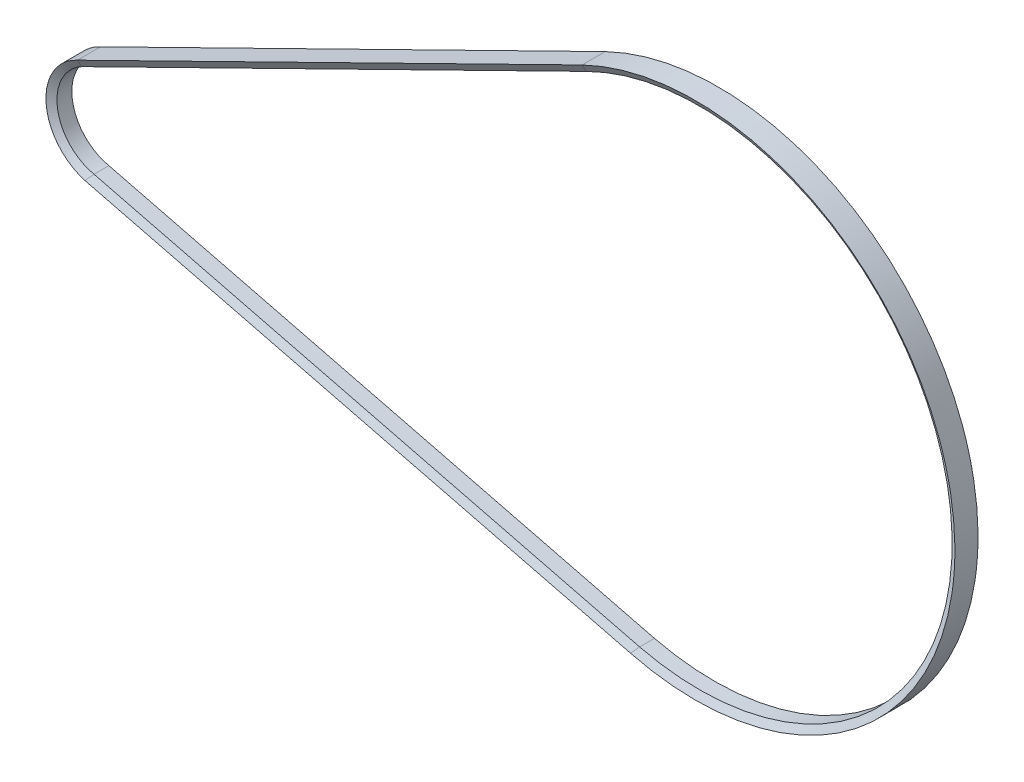
ISO-10303-21;
HEADER;
FILE_DESCRIPTION(('STEP AP214'),'2;1');
FILE_NAME('part.step','',(''),(''),'','','');
FILE_SCHEMA(('AUTOMOTIVE_DESIGN { 1 0 10303 214 1 1 1 1 }'));
ENDSEC;
DATA;
#1=APPLICATION_CONTEXT('core data for automotive mechanical design processes');
#2=APPLICATION_PROTOCOL_DEFINITION('international standard','automotive_design',2000,#1);
#3=PRODUCT_CONTEXT('',#1,'mechanical');
#4=PRODUCT('Part','Part','',(#3));
#5=PRODUCT_RELATED_PRODUCT_CATEGORY('part','',(#4));
#6=PRODUCT_DEFINITION_FORMATION('','',#4);
#7=PRODUCT_DEFINITION_CONTEXT('part definition',#1,'design');
#8=PRODUCT_DEFINITION('design','',#6,#7);
#9=PRODUCT_DEFINITION_SHAPE('','',#8);
#10=(LENGTH_UNIT() NAMED_UNIT(*) SI_UNIT(.MILLI.,.METRE.));
#11=(NAMED_UNIT(*) PLANE_ANGLE_UNIT() SI_UNIT($,.RADIAN.));
#12=(NAMED_UNIT(*) SI_UNIT($,.STERADIAN.) SOLID_ANGLE_UNIT());
#13=UNCERTAINTY_MEASURE_WITH_UNIT(LENGTH_MEASURE(1.E-05),#10,'distance_accuracy_value','');
#14=(GEOMETRIC_REPRESENTATION_CONTEXT(3) GLOBAL_UNCERTAINTY_ASSIGNED_CONTEXT((#13)) GLOBAL_UNIT_ASSIGNED_CONTEXT((#10,
#11,#12)) REPRESENTATION_CONTEXT('',''));
#15=CARTESIAN_POINT('',(0.,0.,0.));
#16=DIRECTION('',(0.,0.,1.));
#17=DIRECTION('',(1.,0.,0.));
#18=AXIS2_PLACEMENT_3D('',#15,#16,#17);
#19=CARTESIAN_POINT('',(-373.678535591055,-13.3664898734539,4.5));
#20=DIRECTION('',(0.441321989165199,-0.897348818397435,0.));
#21=DIRECTION('',(0.897348818397435,0.441321989165199,0.));
#22=AXIS2_PLACEMENT_3D('',#19,#20,#21);
#23=PLANE('',#22);
#24=DIRECTION('',(0.897348818397435,0.441321989165199,0.));
#25=VECTOR('',#24,1.);
#26=CARTESIAN_POINT('',(-373.678535591055,-13.3664898734539,4.5));
#27=LINE('',#26,#25);
#28=CARTESIAN_POINT('',(-373.678535591056,-13.366489873454,4.5));
#29=VERTEX_POINT('',#28);
#30=CARTESIAN_POINT('',(-68.4049083206058,136.769066851602,4.5));
#31=VERTEX_POINT('',#30);
#32=EDGE_CURVE('E11',#29,#31,#27,.T.);
#33=ORIENTED_EDGE('',*,*,#32,.F.);
#34=DIRECTION('',(0.,0.,-1.));
#35=VECTOR('',#34,1.);
#36=CARTESIAN_POINT('',(-373.678535591056,-13.366489873454,4.5));
#37=LINE('',#36,#35);
#38=CARTESIAN_POINT('',(-373.678535591056,-13.366489873454,-4.5));
#39=VERTEX_POINT('',#38);
#40=EDGE_CURVE('E36',#29,#39,#37,.T.);
#41=ORIENTED_EDGE('',*,*,#40,.T.);
#42=DIRECTION('',(0.897348818397435,0.441321989165199,0.));
#43=VECTOR('',#42,1.);
#44=CARTESIAN_POINT('',(-373.678535591055,-13.3664898734539,-4.5));
#45=LINE('',#44,#43);
#46=CARTESIAN_POINT('',(-68.4049083206058,136.769066851602,-4.5));
#47=VERTEX_POINT('',#46);
#48=EDGE_CURVE('E112',#39,#47,#45,.T.);
#49=ORIENTED_EDGE('',*,*,#48,.T.);
#50=DIRECTION('',(0.,0.,-1.));
#51=VECTOR('',#50,1.);
#52=CARTESIAN_POINT('',(-68.4049083206058,136.769066851602,4.5));
#53=LINE('',#52,#51);
#54=EDGE_CURVE('E115',#31,#47,#53,.T.);
#55=ORIENTED_EDGE('',*,*,#54,.F.);
#56=EDGE_LOOP('',(#33,#41,#49,#55));
#57=FACE_BOUND('',#56,.T.);
#58=ADVANCED_FACE('F33',(#57),#23,.T.);
#59=CARTESIAN_POINT('',(-373.678535591055,-13.3664898734539,4.5));
#60=DIRECTION('',(0.227177272400282,-0.461924087083809,0.85733110562755));
#61=DIRECTION('',(0.,-0.880349225609819,-0.4743260913846));
#62=AXIS2_PLACEMENT_3D('',#59,#60,#61);
#63=PLANE('',#62);
#64=DIRECTION('',(0.897348818397435,0.441321989165199,0.));
#65=VECTOR('',#64,1.);
#66=CARTESIAN_POINT('',(-373.678535591055,-8.72648987345393,7.));
#67=LINE('',#66,#65);
#68=CARTESIAN_POINT('',(-373.678535591056,-8.72648987345398,7.));
#69=VERTEX_POINT('',#68);
#70=CARTESIAN_POINT('',(-68.4049083206058,141.409066851602,7.));
#71=VERTEX_POINT('',#70);
#72=EDGE_CURVE('E41',#69,#71,#67,.T.);
#73=ORIENTED_EDGE('',*,*,#72,.F.);
#74=DIRECTION('',(0.,-0.880349225609819,-0.4743260913846));
#75=VECTOR('',#74,1.);
#76=CARTESIAN_POINT('',(-373.678535591056,-13.366489873454,4.5));
#77=LINE('',#76,#75);
#78=EDGE_CURVE('E185',#69,#29,#77,.T.);
#79=ORIENTED_EDGE('',*,*,#78,.T.);
#80=ORIENTED_EDGE('',*,*,#32,.T.);
#81=DIRECTION('',(0.,-0.880349225609819,-0.4743260913846));
#82=VECTOR('',#81,1.);
#83=CARTESIAN_POINT('',(-68.4049083206058,136.769066851602,4.5));
#84=LINE('',#83,#82);
#85=EDGE_CURVE('E139',#71,#31,#84,.T.);
#86=ORIENTED_EDGE('',*,*,#85,.F.);
#87=EDGE_LOOP('',(#73,#79,#80,#86));
#88=FACE_BOUND('',#87,.T.);
#89=ADVANCED_FACE('F224',(#88),#63,.T.);
#90=CARTESIAN_POINT('',(-373.678535591055,-8.72648987345393,7.));
#91=DIRECTION('',(-0.441321989165199,0.897348818397435,0.));
#92=DIRECTION('',(-0.897348818397435,-0.441321989165199,0.));
#93=AXIS2_PLACEMENT_3D('',#90,#91,#92);
#94=PLANE('',#93);
#95=DIRECTION('',(0.897348818397435,0.441321989165199,0.));
#96=VECTOR('',#95,1.);
#97=CARTESIAN_POINT('',(-373.678535591055,-8.72648987345393,-7.));
#98=LINE('',#97,#96);
#99=CARTESIAN_POINT('',(-373.678535591056,-8.72648987345398,-7.));
#100=VERTEX_POINT('',#99);
#101=CARTESIAN_POINT('',(-68.4049083206058,141.409066851602,-7.));
#102=VERTEX_POINT('',#101);
#103=EDGE_CURVE('E121',#100,#102,#98,.T.);
#104=ORIENTED_EDGE('',*,*,#103,.F.);
#105=DIRECTION('',(0.,0.,1.));
#106=VECTOR('',#105,1.);
#107=CARTESIAN_POINT('',(-373.678535591056,-8.72648987345395,7.));
#108=LINE('',#107,#106);
#109=EDGE_CURVE('E166',#100,#69,#108,.T.);
#110=ORIENTED_EDGE('',*,*,#109,.T.);
#111=ORIENTED_EDGE('',*,*,#72,.T.);
#112=DIRECTION('',(0.,0.,1.));
#113=VECTOR('',#112,1.);
#114=CARTESIAN_POINT('',(-68.4049083206058,141.409066851602,7.));
#115=LINE('',#114,#113);
#116=EDGE_CURVE('E143',#102,#71,#115,.T.);
#117=ORIENTED_EDGE('',*,*,#116,.F.);
#118=EDGE_LOOP('',(#104,#110,#111,#117));
#119=FACE_BOUND('',#118,.T.);
#120=ADVANCED_FACE('F228',(#119),#94,.T.);
#121=CARTESIAN_POINT('',(-360.28,-38.2900000000001,0.));
#122=DIRECTION('',(0.,0.,-1.));
#123=DIRECTION('',(-1.,0.,0.));
#124=AXIS2_PLACEMENT_3D('',#121,#122,#123);
#125=CYLINDRICAL_SURFACE('',#124,28.2966802472097);
#126=ORIENTED_EDGE('',*,*,#40,.F.);
#127=CARTESIAN_POINT('',(-360.28,-38.2900000000001,4.5));
#128=DIRECTION('',(0.,0.,-1.));
#129=DIRECTION('',(-0.207597362154742,-0.978214360570521,0.));
#130=AXIS2_PLACEMENT_3D('',#127,#128,#129);
#131=CIRCLE('',#130,28.2966802472097);
#132=CARTESIAN_POINT('',(-366.154316177057,-65.9702189742928,4.5));
#133=VERTEX_POINT('',#132);
#134=EDGE_CURVE('E194',#133,#29,#131,.T.);
#135=ORIENTED_EDGE('',*,*,#134,.F.);
#136=DIRECTION('',(0.,0.,-1.));
#137=VECTOR('',#136,1.);
#138=CARTESIAN_POINT('',(-366.154316177057,-65.9702189742928,4.5));
#139=LINE('',#138,#137);
#140=CARTESIAN_POINT('',(-366.154316177057,-65.9702189742928,-4.5));
#141=VERTEX_POINT('',#140);
#142=EDGE_CURVE('E169',#133,#141,#139,.T.);
#143=ORIENTED_EDGE('',*,*,#142,.T.);
#144=CARTESIAN_POINT('',(-360.28,-38.2900000000001,-4.5));
#145=DIRECTION('',(0.,0.,-1.));
#146=DIRECTION('',(-0.207597362154742,-0.978214360570521,0.));
#147=AXIS2_PLACEMENT_3D('',#144,#145,#146);
#148=CIRCLE('',#147,28.2966802472097);
#149=EDGE_CURVE('E163',#141,#39,#148,.T.);
#150=ORIENTED_EDGE('',*,*,#149,.T.);
#151=EDGE_LOOP('',(#126,#135,#143,#150));
#152=FACE_BOUND('',#151,.T.);
#153=ADVANCED_FACE('F201',(#152),#125,.F.);
#154=CARTESIAN_POINT('',(-369.151926621791,-69.5119603004797,7.));
#155=CARTESIAN_POINT('',(-403.886222366245,-59.6419803204061,7.));
#156=CARTESIAN_POINT('',(-406.567812692719,-23.632302746298,7.));
#157=CARTESIAN_POINT('',(-373.678535591055,-8.72648987345393,7.));
#158=CARTESIAN_POINT('',(-366.154316177057,-65.9702189742927,4.5));
#159=CARTESIAN_POINT('',(-396.948440020382,-59.4350676440545,4.5));
#160=CARTESIAN_POINT('',(-401.405832768871,-28.272302746298,4.5));
#161=CARTESIAN_POINT('',(-373.678535591055,-13.366489873454,4.5));
#162=(BOUNDED_SURFACE() B_SPLINE_SURFACE(1,3,((#154,#155,#156,#157),(#158,#159,#160,#161)),
.UNSPECIFIED.,.F.,.F.,.F.) B_SPLINE_SURFACE_WITH_KNOTS((2,2),(4,4),(0.,1.),(0.,1.),
.UNSPECIFIED.) GEOMETRIC_REPRESENTATION_ITEM() RATIONAL_B_SPLINE_SURFACE(((1.,0.562677170157281,
0.562677170157281,1.),(1.,0.562677170157281,0.562677170157281,1.))) REPRESENTATION_ITEM('') SURFACE());
#163=CARTESIAN_POINT('',(-360.28,-38.2900000000001,7.));
#164=DIRECTION('',(0.,0.,-1.));
#165=DIRECTION('',(-0.273335575326293,-0.961918740466701,0.));
#166=AXIS2_PLACEMENT_3D('',#163,#164,#165);
#167=CIRCLE('',#166,32.4580018945587);
#168=CARTESIAN_POINT('',(-369.151926621791,-69.5119603004797,7.));
#169=VERTEX_POINT('',#168);
#170=EDGE_CURVE('E182',#169,#69,#167,.T.);
#171=DIRECTION('',(0.568737938297763,0.671976127978232,-0.4743260913846));
#172=VECTOR('',#171,1.);
#173=CARTESIAN_POINT('',(-366.154316177057,-65.9702189742928,4.5));
#174=LINE('',#173,#172);
#175=EDGE_CURVE('E178',#169,#133,#174,.T.);
#176=ORIENTED_EDGE('',*,*,#134,.T.);
#177=ORIENTED_EDGE('',*,*,#78,.F.);
#178=ORIENTED_EDGE('',*,*,#170,.F.);
#179=ORIENTED_EDGE('',*,*,#175,.T.);
#180=EDGE_LOOP('',(#176,#177,#178,#179));
#181=FACE_BOUND('',#180,.T.);
#182=ADVANCED_FACE('F237',(#181),#162,.T.);
#183=CARTESIAN_POINT('',(-360.28,-38.2900000000001,0.));
#184=DIRECTION('',(0.,0.,-1.));
#185=DIRECTION('',(-1.,0.,0.));
#186=AXIS2_PLACEMENT_3D('',#183,#184,#185);
#187=CYLINDRICAL_SURFACE('',#186,32.4580018945587);
#188=ORIENTED_EDGE('',*,*,#170,.T.);
#189=ORIENTED_EDGE('',*,*,#109,.F.);
#190=CARTESIAN_POINT('',(-360.28,-38.2900000000001,-7.));
#191=DIRECTION('',(0.,0.,-1.));
#192=DIRECTION('',(-0.273335575326293,-0.961918740466701,0.));
#193=AXIS2_PLACEMENT_3D('',#190,#191,#192);
#194=CIRCLE('',#193,32.4580018945587);
#195=CARTESIAN_POINT('',(-369.151926621791,-69.5119603004797,-7.));
#196=VERTEX_POINT('',#195);
#197=EDGE_CURVE('E162',#196,#100,#194,.T.);
#198=ORIENTED_EDGE('',*,*,#197,.F.);
#199=DIRECTION('',(0.,0.,1.));
#200=VECTOR('',#199,1.);
#201=CARTESIAN_POINT('',(-369.151926621791,-69.5119603004797,7.));
#202=LINE('',#201,#200);
#203=EDGE_CURVE('E155',#196,#169,#202,.T.);
#204=ORIENTED_EDGE('',*,*,#203,.T.);
#205=EDGE_LOOP('',(#188,#189,#198,#204));
#206=FACE_BOUND('',#205,.T.);
#207=ADVANCED_FACE('F209',(#206),#187,.T.);
#208=CARTESIAN_POINT('',(-366.154316177057,-65.9702189742927,-4.5));
#209=CARTESIAN_POINT('',(-396.948440020382,-59.4350676440545,-4.5));
#210=CARTESIAN_POINT('',(-401.405832768871,-28.272302746298,-4.5));
#211=CARTESIAN_POINT('',(-373.678535591055,-13.366489873454,-4.5));
#212=CARTESIAN_POINT('',(-369.151926621791,-69.5119603004797,-7.));
#213=CARTESIAN_POINT('',(-403.886222366245,-59.6419803204061,-7.));
#214=CARTESIAN_POINT('',(-406.567812692719,-23.632302746298,-7.));
#215=CARTESIAN_POINT('',(-373.678535591055,-8.72648987345393,-7.));
#216=(BOUNDED_SURFACE() B_SPLINE_SURFACE(1,3,((#208,#209,#210,#211),(#212,#213,#214,#215)),
.UNSPECIFIED.,.F.,.F.,.F.) B_SPLINE_SURFACE_WITH_KNOTS((2,2),(4,4),(0.,1.),(0.,1.),
.UNSPECIFIED.) GEOMETRIC_REPRESENTATION_ITEM() RATIONAL_B_SPLINE_SURFACE(((1.,0.562677170157281,
0.562677170157281,1.),(1.,0.562677170157281,0.562677170157281,1.))) REPRESENTATION_ITEM('') SURFACE());
#217=DIRECTION('',(0.,0.880349225609819,-0.4743260913846));
#218=VECTOR('',#217,1.);
#219=CARTESIAN_POINT('',(-373.678535591056,-8.72648987345395,-7.));
#220=LINE('',#219,#218);
#221=EDGE_CURVE('E160',#39,#100,#220,.T.);
#222=DIRECTION('',(-0.568737938297763,-0.671976127978232,-0.4743260913846));
#223=VECTOR('',#222,1.);
#224=CARTESIAN_POINT('',(-369.151926621791,-69.5119603004797,-7.));
#225=LINE('',#224,#223);
#226=EDGE_CURVE('E152',#141,#196,#225,.T.);
#227=ORIENTED_EDGE('',*,*,#197,.T.);
#228=ORIENTED_EDGE('',*,*,#221,.F.);
#229=ORIENTED_EDGE('',*,*,#149,.F.);
#230=ORIENTED_EDGE('',*,*,#226,.T.);
#231=EDGE_LOOP('',(#227,#228,#229,#230));
#232=FACE_BOUND('',#231,.T.);
#233=ADVANCED_FACE('F206',(#232),#216,.T.);
#234=CARTESIAN_POINT('',(-36.1439423702126,-148.588776695103,4.5));
#235=DIRECTION('',(0.24285643608116,0.970062241020625,0.));
#236=DIRECTION('',(-0.970062241020625,0.24285643608116,0.));
#237=AXIS2_PLACEMENT_3D('',#234,#235,#236);
#238=PLANE('',#237);
#239=ORIENTED_EDGE('',*,*,#142,.F.);
#240=DIRECTION('',(-0.970062241020625,0.24285643608116,0.));
#241=VECTOR('',#240,1.);
#242=CARTESIAN_POINT('',(-36.1439423702126,-148.588776695103,4.5));
#243=LINE('',#242,#241);
#244=CARTESIAN_POINT('',(-36.1439423702127,-148.588776695103,4.5));
#245=VERTEX_POINT('',#244);
#246=EDGE_CURVE('E77',#245,#133,#243,.T.);
#247=ORIENTED_EDGE('',*,*,#246,.F.);
#248=DIRECTION('',(0.,0.,-1.));
#249=VECTOR('',#248,1.);
#250=CARTESIAN_POINT('',(-36.1439423702127,-148.588776695103,4.5));
#251=LINE('',#250,#249);
#252=CARTESIAN_POINT('',(-36.1439423702127,-148.588776695103,-4.5));
#253=VERTEX_POINT('',#252);
#254=EDGE_CURVE('E159',#245,#253,#251,.T.);
#255=ORIENTED_EDGE('',*,*,#254,.T.);
#256=DIRECTION('',(-0.970062241020625,0.24285643608116,0.));
#257=VECTOR('',#256,1.);
#258=CARTESIAN_POINT('',(-36.1439423702126,-148.588776695103,-4.5));
#259=LINE('',#258,#257);
#260=EDGE_CURVE('E157',#253,#141,#259,.T.);
#261=ORIENTED_EDGE('',*,*,#260,.T.);
#262=EDGE_LOOP('',(#239,#247,#255,#261));
#263=FACE_BOUND('',#262,.T.);
#264=ADVANCED_FACE('F219',(#263),#238,.T.);
#265=CARTESIAN_POINT('',(-36.1439423702126,-148.588776695103,4.5));
#266=DIRECTION('',(0.125014080622026,0.49935443821966,0.85733110562755));
#267=DIRECTION('',(0.,-0.864110077218437,0.503302865528845));
#268=AXIS2_PLACEMENT_3D('',#265,#266,#267);
#269=PLANE('',#268);
#270=ORIENTED_EDGE('',*,*,#246,.T.);
#271=ORIENTED_EDGE('',*,*,#175,.F.);
#272=DIRECTION('',(-0.970062241020625,0.24285643608116,0.));
#273=VECTOR('',#272,1.);
#274=CARTESIAN_POINT('',(-39.1415528149468,-152.13051802129,7.));
#275=LINE('',#274,#273);
#276=CARTESIAN_POINT('',(-39.1415528149468,-152.13051802129,7.));
#277=VERTEX_POINT('',#276);
#278=EDGE_CURVE('E87',#277,#169,#275,.T.);
#279=ORIENTED_EDGE('',*,*,#278,.F.);
#280=DIRECTION('',(0.568737938297763,0.671976127978232,-0.4743260913846));
#281=VECTOR('',#280,1.);
#282=CARTESIAN_POINT('',(-36.1439423702127,-148.588776695103,4.5));
#283=LINE('',#282,#281);
#284=EDGE_CURVE('E175',#277,#245,#283,.T.);
#285=ORIENTED_EDGE('',*,*,#284,.T.);
#286=EDGE_LOOP('',(#270,#271,#279,#285));
#287=FACE_BOUND('',#286,.T.);
#288=ADVANCED_FACE('F212',(#287),#269,.T.);
#289=CARTESIAN_POINT('',(-39.1415528149468,-152.13051802129,7.));
#290=DIRECTION('',(-0.24285643608116,-0.970062241020625,0.));
#291=DIRECTION('',(0.970062241020625,-0.24285643608116,0.));
#292=AXIS2_PLACEMENT_3D('',#289,#290,#291);
#293=PLANE('',#292);
#294=ORIENTED_EDGE('',*,*,#278,.T.);
#295=ORIENTED_EDGE('',*,*,#203,.F.);
#296=DIRECTION('',(-0.970062241020625,0.24285643608116,0.));
#297=VECTOR('',#296,1.);
#298=CARTESIAN_POINT('',(-39.1415528149468,-152.13051802129,-7.));
#299=LINE('',#298,#297);
#300=CARTESIAN_POINT('',(-39.1415528149468,-152.13051802129,-7.));
#301=VERTEX_POINT('',#300);
#302=EDGE_CURVE('E95',#301,#196,#299,.T.);
#303=ORIENTED_EDGE('',*,*,#302,.F.);
#304=DIRECTION('',(0.,0.,1.));
#305=VECTOR('',#304,1.);
#306=CARTESIAN_POINT('',(-39.1415528149469,-152.13051802129,7.));
#307=LINE('',#306,#305);
#308=EDGE_CURVE('E150',#301,#277,#307,.T.);
#309=ORIENTED_EDGE('',*,*,#308,.T.);
#310=EDGE_LOOP('',(#294,#295,#303,#309));
#311=FACE_BOUND('',#310,.T.);
#312=ADVANCED_FACE('F210',(#311),#293,.T.);
#313=CARTESIAN_POINT('',(-39.1415528149468,-152.13051802129,-7.));
#314=DIRECTION('',(0.125014080622026,0.49935443821966,-0.85733110562755));
#315=DIRECTION('',(0.,0.864110077218437,0.503302865528845));
#316=AXIS2_PLACEMENT_3D('',#313,#314,#315);
#317=PLANE('',#316);
#318=ORIENTED_EDGE('',*,*,#302,.T.);
#319=ORIENTED_EDGE('',*,*,#226,.F.);
#320=ORIENTED_EDGE('',*,*,#260,.F.);
#321=DIRECTION('',(-0.568737938297763,-0.671976127978232,-0.4743260913846));
#322=VECTOR('',#321,1.);
#323=CARTESIAN_POINT('',(-39.1415528149469,-152.13051802129,-7.));
#324=LINE('',#323,#322);
#325=EDGE_CURVE('E131',#253,#301,#324,.T.);
#326=ORIENTED_EDGE('',*,*,#325,.T.);
#327=EDGE_LOOP('',(#318,#319,#320,#326));
#328=FACE_BOUND('',#327,.T.);
#329=ADVANCED_FACE('F204',(#328),#317,.T.);
#330=CARTESIAN_POINT('',(0.,0.,0.));
#331=DIRECTION('',(0.,0.,-1.));
#332=DIRECTION('',(-1.,0.,0.));
#333=AXIS2_PLACEMENT_3D('',#330,#331,#332);
#334=CYLINDRICAL_SURFACE('',#333,152.921578365542);
#335=ORIENTED_EDGE('',*,*,#254,.F.);
#336=CARTESIAN_POINT('',(0.,0.,4.5));
#337=DIRECTION('',(0.,0.,-1.));
#338=DIRECTION('',(-0.447320182355766,0.894373889632968,0.));
#339=AXIS2_PLACEMENT_3D('',#336,#337,#338);
#340=CIRCLE('',#339,152.921578365542);
#341=EDGE_CURVE('E138',#31,#245,#340,.T.);
#342=ORIENTED_EDGE('',*,*,#341,.F.);
#343=ORIENTED_EDGE('',*,*,#54,.T.);
#344=CARTESIAN_POINT('',(0.,0.,-4.5));
#345=DIRECTION('',(0.,0.,-1.));
#346=DIRECTION('',(-0.447320182355766,0.894373889632968,0.));
#347=AXIS2_PLACEMENT_3D('',#344,#345,#346);
#348=CIRCLE('',#347,152.921578365542);
#349=EDGE_CURVE('E127',#47,#253,#348,.T.);
#350=ORIENTED_EDGE('',*,*,#349,.T.);
#351=EDGE_LOOP('',(#335,#342,#343,#350));
#352=FACE_BOUND('',#351,.T.);
#353=ADVANCED_FACE('F136',(#352),#334,.F.);
#354=CARTESIAN_POINT('',(-68.4049083206058,141.409066851602,7.));
#355=CARTESIAN_POINT('',(39.6597644770448,193.684031958168,7.));
#356=CARTESIAN_POINT('',(144.402017869406,135.035026527161,7.));
#357=CARTESIAN_POINT('',(156.310371688934,15.5827909136536,7.));
#358=CARTESIAN_POINT('',(168.218725508462,-103.869444699854,7.));
#359=CARTESIAN_POINT('',(77.1164426483868,-182.042455013125,7.));
#360=CARTESIAN_POINT('',(-39.1415528149468,-152.13051802129,7.));
#361=CARTESIAN_POINT('',(-68.4049083206058,136.769066851602,4.5));
#362=CARTESIAN_POINT('',(36.1138809425236,189.044031958168,4.5));
#363=CARTESIAN_POINT('',(138.82538568336,133.301803084572,4.5));
#364=CARTESIAN_POINT('',(151.953579304995,17.1790240179483,4.5));
#365=CARTESIAN_POINT('',(165.08177292663,-98.9437550486758,4.5));
#366=CARTESIAN_POINT('',(77.4074577801771,-176.209942669935,4.5));
#367=CARTESIAN_POINT('',(-36.1439423702127,-148.588776695103,4.5));
#368=(BOUNDED_SURFACE() B_SPLINE_SURFACE(1,3,((#354,#355,#356,#357,#358,#359,#360),(#361,#362,
#363,#364,#365,#366,#367)),.UNSPECIFIED.,.F.,.F.,.F.) B_SPLINE_SURFACE_WITH_KNOTS((2,2),(4,3,4),
(0.,1.),(0.,0.5,1.),
.UNSPECIFIED.) GEOMETRIC_REPRESENTATION_ITEM() RATIONAL_B_SPLINE_SURFACE(((1.,0.715137310020638,
0.715137310020638,1.,0.715137310020638,0.715137310020638,1.),(1.,0.715137310020638,
0.715137310020638,1.,0.715137310020638,0.715137310020638,1.))) REPRESENTATION_ITEM('') SURFACE());
#369=CARTESIAN_POINT('',(0.,0.,7.));
#370=DIRECTION('',(0.,0.,-1.));
#371=DIRECTION('',(-0.435463776370275,0.900206253849272,0.));
#372=AXIS2_PLACEMENT_3D('',#369,#370,#371);
#373=CIRCLE('',#372,157.085186030356);
#374=EDGE_CURVE('E172',#71,#277,#373,.T.);
#375=ORIENTED_EDGE('',*,*,#341,.T.);
#376=ORIENTED_EDGE('',*,*,#284,.F.);
#377=ORIENTED_EDGE('',*,*,#374,.F.);
#378=ORIENTED_EDGE('',*,*,#85,.T.);
#379=EDGE_LOOP('',(#375,#376,#377,#378));
#380=FACE_BOUND('',#379,.T.);
#381=ADVANCED_FACE('F242',(#380),#368,.T.);
#382=CARTESIAN_POINT('',(0.,0.,0.));
#383=DIRECTION('',(0.,0.,-1.));
#384=DIRECTION('',(-1.,0.,0.));
#385=AXIS2_PLACEMENT_3D('',#382,#383,#384);
#386=CYLINDRICAL_SURFACE('',#385,157.085186030356);
#387=ORIENTED_EDGE('',*,*,#374,.T.);
#388=ORIENTED_EDGE('',*,*,#308,.F.);
#389=CARTESIAN_POINT('',(0.,0.,-7.));
#390=DIRECTION('',(0.,0.,-1.));
#391=DIRECTION('',(-0.435463776370275,0.900206253849272,0.));
#392=AXIS2_PLACEMENT_3D('',#389,#390,#391);
#393=CIRCLE('',#392,157.085186030356);
#394=EDGE_CURVE('E149',#102,#301,#393,.T.);
#395=ORIENTED_EDGE('',*,*,#394,.F.);
#396=ORIENTED_EDGE('',*,*,#116,.T.);
#397=EDGE_LOOP('',(#387,#388,#395,#396));
#398=FACE_BOUND('',#397,.T.);
#399=ADVANCED_FACE('F256',(#398),#386,.T.);
#400=CARTESIAN_POINT('',(-68.4049083206058,136.769066851602,-4.5));
#401=CARTESIAN_POINT('',(36.1138809425236,189.044031958168,-4.5));
#402=CARTESIAN_POINT('',(138.82538568336,133.301803084572,-4.5));
#403=CARTESIAN_POINT('',(151.953579304995,17.1790240179483,-4.5));
#404=CARTESIAN_POINT('',(165.08177292663,-98.9437550486758,-4.5));
#405=CARTESIAN_POINT('',(77.4074577801771,-176.209942669935,-4.5));
#406=CARTESIAN_POINT('',(-36.1439423702127,-148.588776695103,-4.5));
#407=CARTESIAN_POINT('',(-68.4049083206058,141.409066851602,-7.));
#408=CARTESIAN_POINT('',(39.6597644770448,193.684031958168,-7.));
#409=CARTESIAN_POINT('',(144.402017869406,135.035026527161,-7.));
#410=CARTESIAN_POINT('',(156.310371688934,15.5827909136536,-7.));
#411=CARTESIAN_POINT('',(168.218725508462,-103.869444699854,-7.));
#412=CARTESIAN_POINT('',(77.1164426483868,-182.042455013125,-7.));
#413=CARTESIAN_POINT('',(-39.1415528149468,-152.13051802129,-7.));
#414=(BOUNDED_SURFACE() B_SPLINE_SURFACE(1,3,((#400,#401,#402,#403,#404,#405,#406),(#407,#408,
#409,#410,#411,#412,#413)),.UNSPECIFIED.,.F.,.F.,.F.) B_SPLINE_SURFACE_WITH_KNOTS((2,2),(4,3,4),
(0.,1.),(0.,0.5,1.),
.UNSPECIFIED.) GEOMETRIC_REPRESENTATION_ITEM() RATIONAL_B_SPLINE_SURFACE(((1.,0.715137310020638,
0.715137310020638,1.,0.715137310020638,0.715137310020638,1.),(1.,0.715137310020638,
0.715137310020638,1.,0.715137310020638,0.715137310020638,1.))) REPRESENTATION_ITEM('') SURFACE());
#415=DIRECTION('',(0.,0.880349225609819,-0.4743260913846));
#416=VECTOR('',#415,1.);
#417=CARTESIAN_POINT('',(-68.4049083206058,141.409066851602,-7.));
#418=LINE('',#417,#416);
#419=EDGE_CURVE('E130',#47,#102,#418,.T.);
#420=ORIENTED_EDGE('',*,*,#394,.T.);
#421=ORIENTED_EDGE('',*,*,#325,.F.);
#422=ORIENTED_EDGE('',*,*,#349,.F.);
#423=ORIENTED_EDGE('',*,*,#419,.T.);
#424=EDGE_LOOP('',(#420,#421,#422,#423));
#425=FACE_BOUND('',#424,.T.);
#426=ADVANCED_FACE('F129',(#425),#414,.T.);
#427=CARTESIAN_POINT('',(-373.678535591055,-8.72648987345393,-7.));
#428=DIRECTION('',(0.227177272400282,-0.461924087083809,-0.85733110562755));
#429=DIRECTION('',(0.,0.880349225609819,-0.4743260913846));
#430=AXIS2_PLACEMENT_3D('',#427,#428,#429);
#431=PLANE('',#430);
#432=ORIENTED_EDGE('',*,*,#221,.T.);
#433=ORIENTED_EDGE('',*,*,#103,.T.);
#434=ORIENTED_EDGE('',*,*,#419,.F.);
#435=ORIENTED_EDGE('',*,*,#48,.F.);
#436=EDGE_LOOP('',(#432,#433,#434,#435));
#437=FACE_BOUND('',#436,.T.);
#438=ADVANCED_FACE('F141',(#437),#431,.T.);
#439=CLOSED_SHELL('',(#58,#89,#120,#153,#182,#207,#233,#264,#288,#312,#329,#353,#381,#399,#426,#438));
#440=MANIFOLD_SOLID_BREP('B2',#439);
#441=ADVANCED_BREP_SHAPE_REPRESENTATION('',(#18,#440),#14);
#442=SHAPE_DEFINITION_REPRESENTATION(#9,#441);
ENDSEC;
END-ISO-10303-21;
